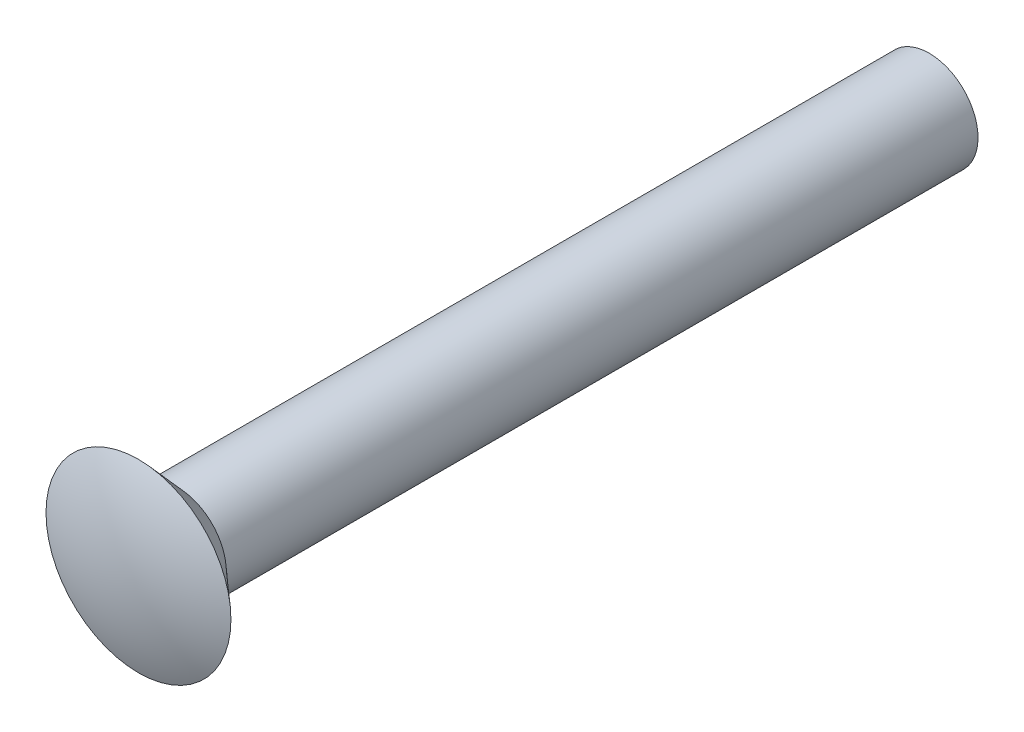
ISO-10303-21;
HEADER;
FILE_DESCRIPTION(('STEP AP214'),'2;1');
FILE_NAME('part.step','',(''),(''),'','','');
FILE_SCHEMA(('AUTOMOTIVE_DESIGN { 1 0 10303 214 1 1 1 1 }'));
ENDSEC;
DATA;
#1=APPLICATION_CONTEXT('core data for automotive mechanical design processes');
#2=APPLICATION_PROTOCOL_DEFINITION('international standard','automotive_design',2000,#1);
#3=PRODUCT_CONTEXT('',#1,'mechanical');
#4=PRODUCT('Part','Part','',(#3));
#5=PRODUCT_RELATED_PRODUCT_CATEGORY('part','',(#4));
#6=PRODUCT_DEFINITION_FORMATION('','',#4);
#7=PRODUCT_DEFINITION_CONTEXT('part definition',#1,'design');
#8=PRODUCT_DEFINITION('design','',#6,#7);
#9=PRODUCT_DEFINITION_SHAPE('','',#8);
#10=(LENGTH_UNIT() NAMED_UNIT(*) SI_UNIT(.MILLI.,.METRE.));
#11=(NAMED_UNIT(*) PLANE_ANGLE_UNIT() SI_UNIT($,.RADIAN.));
#12=(NAMED_UNIT(*) SI_UNIT($,.STERADIAN.) SOLID_ANGLE_UNIT());
#13=UNCERTAINTY_MEASURE_WITH_UNIT(LENGTH_MEASURE(1.E-05),#10,'distance_accuracy_value','');
#14=(GEOMETRIC_REPRESENTATION_CONTEXT(3) GLOBAL_UNCERTAINTY_ASSIGNED_CONTEXT((#13)) GLOBAL_UNIT_ASSIGNED_CONTEXT((#10,
#11,#12)) REPRESENTATION_CONTEXT('',''));
#15=CARTESIAN_POINT('',(0.,0.,0.));
#16=DIRECTION('',(0.,0.,1.));
#17=DIRECTION('',(1.,0.,0.));
#18=AXIS2_PLACEMENT_3D('',#15,#16,#17);
#19=CARTESIAN_POINT('',(0.,0.,-83.4543560573179));
#20=DIRECTION('',(0.,0.,1.));
#21=DIRECTION('',(0.,-1.,0.));
#22=AXIS2_PLACEMENT_3D('',#19,#20,#21);
#23=CONICAL_SURFACE('',#22,3.,1.10714871779409);
#24=CARTESIAN_POINT('',(0.,0.,-82.4543560573179));
#25=DIRECTION('',(0.,0.,-1.));
#26=DIRECTION('',(0.,1.,0.));
#27=AXIS2_PLACEMENT_3D('',#24,#25,#26);
#28=CIRCLE('',#27,4.99999999999999);
#29=CARTESIAN_POINT('',(0.,4.99999999999999,-82.4543560573179));
#30=VERTEX_POINT('',#29);
#31=EDGE_CURVE('E10',#30,#30,#28,.T.);
#32=ORIENTED_EDGE('',*,*,#31,.T.);
#33=EDGE_LOOP('',(#32));
#34=FACE_BOUND('',#33,.T.);
#35=CARTESIAN_POINT('',(0.,0.,-83.4543560573179));
#36=DIRECTION('',(0.,0.,-1.));
#37=DIRECTION('',(0.,1.,0.));
#38=AXIS2_PLACEMENT_3D('',#35,#36,#37);
#39=CIRCLE('',#38,3.);
#40=CARTESIAN_POINT('',(0.,3.,-83.4543560573179));
#41=VERTEX_POINT('',#40);
#42=EDGE_CURVE('E60',#41,#41,#39,.T.);
#43=ORIENTED_EDGE('',*,*,#42,.F.);
#44=EDGE_LOOP('',(#43));
#45=FACE_BOUND('',#44,.T.);
#46=ADVANCED_FACE('F43',(#34,#45),#23,.T.);
#47=CARTESIAN_POINT('',(0.,0.,-83.4543560573179));
#48=DIRECTION('',(0.,0.,-1.));
#49=DIRECTION('',(0.,1.,0.));
#50=AXIS2_PLACEMENT_3D('',#47,#48,#49);
#51=CYLINDRICAL_SURFACE('',#50,5.);
#52=CARTESIAN_POINT('',(0.,0.,-5.45435605731787));
#53=DIRECTION('',(0.,0.,-1.));
#54=DIRECTION('',(0.,1.,0.));
#55=AXIS2_PLACEMENT_3D('',#52,#53,#54);
#56=CIRCLE('',#55,5.);
#57=CARTESIAN_POINT('',(0.,4.99999999999999,-5.45435605731787));
#58=VERTEX_POINT('',#57);
#59=EDGE_CURVE('E50',#58,#58,#56,.T.);
#60=ORIENTED_EDGE('',*,*,#59,.T.);
#61=EDGE_LOOP('',(#60));
#62=FACE_BOUND('',#61,.T.);
#63=ORIENTED_EDGE('',*,*,#31,.F.);
#64=EDGE_LOOP('',(#63));
#65=FACE_BOUND('',#64,.T.);
#66=ADVANCED_FACE('F70',(#62,#65),#51,.T.);
#67=CARTESIAN_POINT('',(0.,0.,-5.45435605731787));
#68=DIRECTION('',(0.,0.,1.));
#69=DIRECTION('',(0.,-1.,0.));
#70=AXIS2_PLACEMENT_3D('',#67,#68,#69);
#71=CONICAL_SURFACE('',#70,5.,0.841068670567929);
#72=CARTESIAN_POINT('',(0.,0.,-1.45435605731786));
#73=DIRECTION('',(0.,0.,-1.));
#74=DIRECTION('',(0.,1.,0.));
#75=AXIS2_PLACEMENT_3D('',#72,#73,#74);
#76=CIRCLE('',#75,9.47213595499958);
#77=CARTESIAN_POINT('',(0.,9.47213595499957,-1.45435605731786));
#78=VERTEX_POINT('',#77);
#79=EDGE_CURVE('E55',#78,#78,#76,.T.);
#80=ORIENTED_EDGE('',*,*,#79,.T.);
#81=EDGE_LOOP('',(#80));
#82=FACE_BOUND('',#81,.T.);
#83=ORIENTED_EDGE('',*,*,#59,.F.);
#84=EDGE_LOOP('',(#83));
#85=FACE_BOUND('',#84,.T.);
#86=ADVANCED_FACE('F74',(#82,#85),#71,.T.);
#87=CARTESIAN_POINT('',(0.,0.,-22.8846959448168));
#88=DIRECTION('',(0.,0.,-1.));
#89=DIRECTION('',(0.,1.,0.));
#90=AXIS2_PLACEMENT_3D('',#87,#88,#89);
#91=SPHERICAL_SURFACE('',#90,23.4303398874989);
#92=ORIENTED_EDGE('',*,*,#79,.F.);
#93=EDGE_LOOP('',(#92));
#94=FACE_BOUND('',#93,.T.);
#95=ADVANCED_FACE('F78',(#94),#91,.T.);
#96=CARTESIAN_POINT('',(0.,0.,-83.4543560573179));
#97=DIRECTION('',(0.,0.,-1.));
#98=DIRECTION('',(0.,1.,0.));
#99=AXIS2_PLACEMENT_3D('',#96,#97,#98);
#100=PLANE('',#99);
#101=ORIENTED_EDGE('',*,*,#42,.T.);
#102=EDGE_LOOP('',(#101));
#103=FACE_BOUND('',#102,.T.);
#104=ADVANCED_FACE('F67',(#103),#100,.T.);
#105=CLOSED_SHELL('',(#46,#66,#86,#95,#104));
#106=MANIFOLD_SOLID_BREP('B2',#105);
#107=ADVANCED_BREP_SHAPE_REPRESENTATION('',(#18,#106),#14);
#108=SHAPE_DEFINITION_REPRESENTATION(#9,#107);
ENDSEC;
END-ISO-10303-21;
